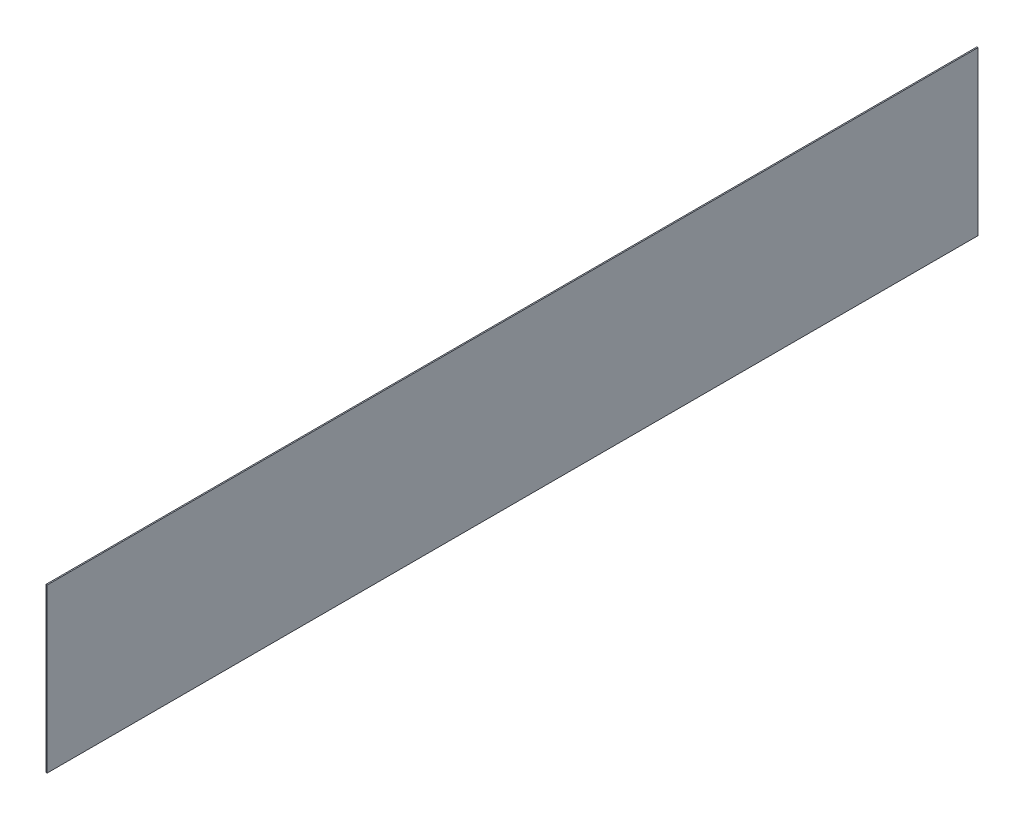
ISO-10303-21;
HEADER;
FILE_DESCRIPTION(('STEP AP214'),'2;1');
FILE_NAME('part.step','',(''),(''),'','','');
FILE_SCHEMA(('AUTOMOTIVE_DESIGN { 1 0 10303 214 1 1 1 1 }'));
ENDSEC;
DATA;
#1=APPLICATION_CONTEXT('core data for automotive mechanical design processes');
#2=APPLICATION_PROTOCOL_DEFINITION('international standard','automotive_design',2000,#1);
#3=PRODUCT_CONTEXT('',#1,'mechanical');
#4=PRODUCT('Part','Part','',(#3));
#5=PRODUCT_RELATED_PRODUCT_CATEGORY('part','',(#4));
#6=PRODUCT_DEFINITION_FORMATION('','',#4);
#7=PRODUCT_DEFINITION_CONTEXT('part definition',#1,'design');
#8=PRODUCT_DEFINITION('design','',#6,#7);
#9=PRODUCT_DEFINITION_SHAPE('','',#8);
#10=(LENGTH_UNIT() NAMED_UNIT(*) SI_UNIT(.MILLI.,.METRE.));
#11=(NAMED_UNIT(*) PLANE_ANGLE_UNIT() SI_UNIT($,.RADIAN.));
#12=(NAMED_UNIT(*) SI_UNIT($,.STERADIAN.) SOLID_ANGLE_UNIT());
#13=UNCERTAINTY_MEASURE_WITH_UNIT(LENGTH_MEASURE(1.E-05),#10,'distance_accuracy_value','');
#14=(GEOMETRIC_REPRESENTATION_CONTEXT(3) GLOBAL_UNCERTAINTY_ASSIGNED_CONTEXT((#13)) GLOBAL_UNIT_ASSIGNED_CONTEXT((#10,
#11,#12)) REPRESENTATION_CONTEXT('',''));
#15=CARTESIAN_POINT('',(0.,0.,0.));
#16=DIRECTION('',(0.,0.,1.));
#17=DIRECTION('',(1.,0.,0.));
#18=AXIS2_PLACEMENT_3D('',#15,#16,#17);
#19=CARTESIAN_POINT('',(10.,700.,-4000.));
#20=DIRECTION('',(0.,0.,1.));
#21=DIRECTION('',(1.,0.,0.));
#22=AXIS2_PLACEMENT_3D('',#19,#20,#21);
#23=PLANE('',#22);
#24=DIRECTION('',(0.,1.,0.));
#25=VECTOR('',#24,1.);
#26=CARTESIAN_POINT('',(0.,700.,-4000.));
#27=LINE('',#26,#25);
#28=CARTESIAN_POINT('',(0.,-700.000000000001,-4000.));
#29=VERTEX_POINT('',#28);
#30=CARTESIAN_POINT('',(0.,700.,-4000.));
#31=VERTEX_POINT('',#30);
#32=EDGE_CURVE('E107',#29,#31,#27,.T.);
#33=ORIENTED_EDGE('',*,*,#32,.T.);
#34=DIRECTION('',(-1.,0.,0.));
#35=VECTOR('',#34,1.);
#36=CARTESIAN_POINT('',(10.,700.,-4000.));
#37=LINE('',#36,#35);
#38=CARTESIAN_POINT('',(10.,700.,-4000.));
#39=VERTEX_POINT('',#38);
#40=EDGE_CURVE('E11',#39,#31,#37,.T.);
#41=ORIENTED_EDGE('',*,*,#40,.F.);
#42=DIRECTION('',(0.,1.,0.));
#43=VECTOR('',#42,1.);
#44=CARTESIAN_POINT('',(10.,700.,-4000.));
#45=LINE('',#44,#43);
#46=CARTESIAN_POINT('',(10.,-700.000000000001,-4000.));
#47=VERTEX_POINT('',#46);
#48=EDGE_CURVE('E91',#47,#39,#45,.T.);
#49=ORIENTED_EDGE('',*,*,#48,.F.);
#50=DIRECTION('',(-1.,0.,0.));
#51=VECTOR('',#50,1.);
#52=CARTESIAN_POINT('',(10.,-700.000000000001,-4000.));
#53=LINE('',#52,#51);
#54=EDGE_CURVE('E103',#47,#29,#53,.T.);
#55=ORIENTED_EDGE('',*,*,#54,.T.);
#56=EDGE_LOOP('',(#33,#41,#49,#55));
#57=FACE_BOUND('',#56,.T.);
#58=ADVANCED_FACE('F39',(#57),#23,.F.);
#59=CARTESIAN_POINT('',(10.,700.,4000.));
#60=DIRECTION('',(0.,-1.,0.));
#61=DIRECTION('',(0.,0.,-1.));
#62=AXIS2_PLACEMENT_3D('',#59,#60,#61);
#63=PLANE('',#62);
#64=DIRECTION('',(0.,0.,1.));
#65=VECTOR('',#64,1.);
#66=CARTESIAN_POINT('',(0.,700.,4000.));
#67=LINE('',#66,#65);
#68=CARTESIAN_POINT('',(0.,700.,4000.));
#69=VERTEX_POINT('',#68);
#70=EDGE_CURVE('E96',#31,#69,#67,.T.);
#71=ORIENTED_EDGE('',*,*,#70,.T.);
#72=DIRECTION('',(-1.,0.,0.));
#73=VECTOR('',#72,1.);
#74=CARTESIAN_POINT('',(10.,700.,4000.));
#75=LINE('',#74,#73);
#76=CARTESIAN_POINT('',(10.,700.,4000.));
#77=VERTEX_POINT('',#76);
#78=EDGE_CURVE('E48',#77,#69,#75,.T.);
#79=ORIENTED_EDGE('',*,*,#78,.F.);
#80=DIRECTION('',(0.,0.,1.));
#81=VECTOR('',#80,1.);
#82=CARTESIAN_POINT('',(10.,700.,4000.));
#83=LINE('',#82,#81);
#84=EDGE_CURVE('E86',#39,#77,#83,.T.);
#85=ORIENTED_EDGE('',*,*,#84,.F.);
#86=ORIENTED_EDGE('',*,*,#40,.T.);
#87=EDGE_LOOP('',(#71,#79,#85,#86));
#88=FACE_BOUND('',#87,.T.);
#89=ADVANCED_FACE('F95',(#88),#63,.F.);
#90=CARTESIAN_POINT('',(10.,700.,4000.));
#91=DIRECTION('',(0.,0.,-1.));
#92=DIRECTION('',(0.,1.,0.));
#93=AXIS2_PLACEMENT_3D('',#90,#91,#92);
#94=PLANE('',#93);
#95=DIRECTION('',(0.,-1.,0.));
#96=VECTOR('',#95,1.);
#97=CARTESIAN_POINT('',(0.,700.,4000.));
#98=LINE('',#97,#96);
#99=CARTESIAN_POINT('',(0.,-700.000000000001,4000.));
#100=VERTEX_POINT('',#99);
#101=EDGE_CURVE('E73',#69,#100,#98,.T.);
#102=ORIENTED_EDGE('',*,*,#101,.T.);
#103=DIRECTION('',(-1.,0.,0.));
#104=VECTOR('',#103,1.);
#105=CARTESIAN_POINT('',(10.,-700.000000000001,4000.));
#106=LINE('',#105,#104);
#107=CARTESIAN_POINT('',(10.,-700.000000000001,4000.));
#108=VERTEX_POINT('',#107);
#109=EDGE_CURVE('E98',#108,#100,#106,.T.);
#110=ORIENTED_EDGE('',*,*,#109,.F.);
#111=DIRECTION('',(0.,-1.,0.));
#112=VECTOR('',#111,1.);
#113=CARTESIAN_POINT('',(10.,700.,4000.));
#114=LINE('',#113,#112);
#115=EDGE_CURVE('E89',#77,#108,#114,.T.);
#116=ORIENTED_EDGE('',*,*,#115,.F.);
#117=ORIENTED_EDGE('',*,*,#78,.T.);
#118=EDGE_LOOP('',(#102,#110,#116,#117));
#119=FACE_BOUND('',#118,.T.);
#120=ADVANCED_FACE('F99',(#119),#94,.F.);
#121=CARTESIAN_POINT('',(10.,-700.000000000001,4000.));
#122=DIRECTION('',(0.,1.,0.));
#123=DIRECTION('',(0.,0.,1.));
#124=AXIS2_PLACEMENT_3D('',#121,#122,#123);
#125=PLANE('',#124);
#126=DIRECTION('',(0.,0.,-1.));
#127=VECTOR('',#126,1.);
#128=CARTESIAN_POINT('',(0.,-700.000000000001,4000.));
#129=LINE('',#128,#127);
#130=EDGE_CURVE('E79',#100,#29,#129,.T.);
#131=ORIENTED_EDGE('',*,*,#130,.T.);
#132=ORIENTED_EDGE('',*,*,#54,.F.);
#133=DIRECTION('',(0.,0.,-1.));
#134=VECTOR('',#133,1.);
#135=CARTESIAN_POINT('',(10.,-700.000000000001,4000.));
#136=LINE('',#135,#134);
#137=EDGE_CURVE('E56',#108,#47,#136,.T.);
#138=ORIENTED_EDGE('',*,*,#137,.F.);
#139=ORIENTED_EDGE('',*,*,#109,.T.);
#140=EDGE_LOOP('',(#131,#132,#138,#139));
#141=FACE_BOUND('',#140,.T.);
#142=ADVANCED_FACE('F120',(#141),#125,.F.);
#143=CARTESIAN_POINT('',(10.,0.,0.));
#144=DIRECTION('',(1.,0.,0.));
#145=DIRECTION('',(0.,0.,-1.));
#146=AXIS2_PLACEMENT_3D('',#143,#144,#145);
#147=PLANE('',#146);
#148=ORIENTED_EDGE('',*,*,#48,.T.);
#149=ORIENTED_EDGE('',*,*,#84,.T.);
#150=ORIENTED_EDGE('',*,*,#115,.T.);
#151=ORIENTED_EDGE('',*,*,#137,.T.);
#152=EDGE_LOOP('',(#148,#149,#150,#151));
#153=FACE_BOUND('',#152,.T.);
#154=ADVANCED_FACE('F87',(#153),#147,.T.);
#155=CARTESIAN_POINT('',(0.,0.,0.));
#156=DIRECTION('',(1.,0.,0.));
#157=DIRECTION('',(0.,0.,-1.));
#158=AXIS2_PLACEMENT_3D('',#155,#156,#157);
#159=PLANE('',#158);
#160=ORIENTED_EDGE('',*,*,#32,.F.);
#161=ORIENTED_EDGE('',*,*,#130,.F.);
#162=ORIENTED_EDGE('',*,*,#101,.F.);
#163=ORIENTED_EDGE('',*,*,#70,.F.);
#164=EDGE_LOOP('',(#160,#161,#162,#163));
#165=FACE_BOUND('',#164,.T.);
#166=ADVANCED_FACE('F123',(#165),#159,.F.);
#167=CLOSED_SHELL('',(#58,#89,#120,#142,#154,#166));
#168=MANIFOLD_SOLID_BREP('B2',#167);
#169=ADVANCED_BREP_SHAPE_REPRESENTATION('',(#18,#168),#14);
#170=SHAPE_DEFINITION_REPRESENTATION(#9,#169);
ENDSEC;
END-ISO-10303-21;
